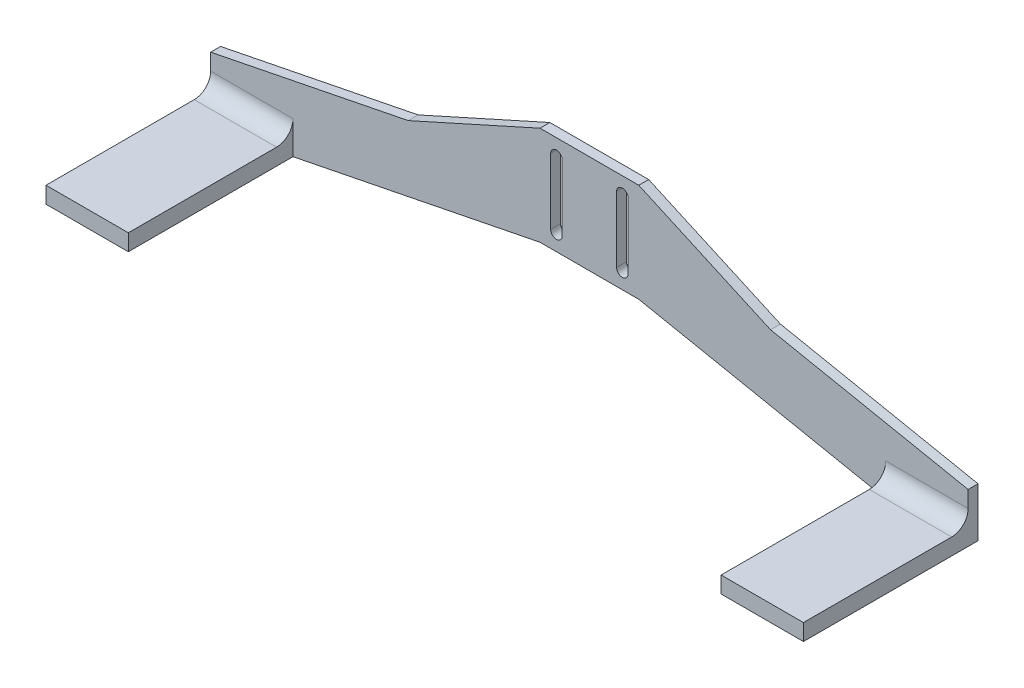
ISO-10303-21;
HEADER;
FILE_DESCRIPTION(('STEP AP214'),'2;1');
FILE_NAME('part.step','',(''),(''),'','','');
FILE_SCHEMA(('AUTOMOTIVE_DESIGN { 1 0 10303 214 1 1 1 1 }'));
ENDSEC;
DATA;
#1=APPLICATION_CONTEXT('core data for automotive mechanical design processes');
#2=APPLICATION_PROTOCOL_DEFINITION('international standard','automotive_design',2000,#1);
#3=PRODUCT_CONTEXT('',#1,'mechanical');
#4=PRODUCT('Part','Part','',(#3));
#5=PRODUCT_RELATED_PRODUCT_CATEGORY('part','',(#4));
#6=PRODUCT_DEFINITION_FORMATION('','',#4);
#7=PRODUCT_DEFINITION_CONTEXT('part definition',#1,'design');
#8=PRODUCT_DEFINITION('design','',#6,#7);
#9=PRODUCT_DEFINITION_SHAPE('','',#8);
#10=(LENGTH_UNIT() NAMED_UNIT(*) SI_UNIT(.MILLI.,.METRE.));
#11=(NAMED_UNIT(*) PLANE_ANGLE_UNIT() SI_UNIT($,.RADIAN.));
#12=(NAMED_UNIT(*) SI_UNIT($,.STERADIAN.) SOLID_ANGLE_UNIT());
#13=UNCERTAINTY_MEASURE_WITH_UNIT(LENGTH_MEASURE(1.E-05),#10,'distance_accuracy_value','');
#14=(GEOMETRIC_REPRESENTATION_CONTEXT(3) GLOBAL_UNCERTAINTY_ASSIGNED_CONTEXT((#13)) GLOBAL_UNIT_ASSIGNED_CONTEXT((#10,
#11,#12)) REPRESENTATION_CONTEXT('',''));
#15=CARTESIAN_POINT('',(0.,0.,0.));
#16=DIRECTION('',(0.,0.,1.));
#17=DIRECTION('',(1.,0.,0.));
#18=AXIS2_PLACEMENT_3D('',#15,#16,#17);
#19=CARTESIAN_POINT('',(0.,0.,3.));
#20=DIRECTION('',(0.,0.,1.));
#21=DIRECTION('',(1.,0.,0.));
#22=AXIS2_PLACEMENT_3D('',#19,#20,#21);
#23=PLANE('',#22);
#24=DIRECTION('',(0.,1.,0.));
#25=VECTOR('',#24,1.);
#26=CARTESIAN_POINT('',(90.,-30.,3.));
#27=LINE('',#26,#25);
#28=CARTESIAN_POINT('',(90.,-30.,3.));
#29=VERTEX_POINT('',#28);
#30=CARTESIAN_POINT('',(90.,-20.,3.));
#31=VERTEX_POINT('',#30);
#32=EDGE_CURVE('E237',#29,#31,#27,.T.);
#33=ORIENTED_EDGE('',*,*,#32,.T.);
#34=DIRECTION('',(1.,0.,0.));
#35=VECTOR('',#34,1.);
#36=CARTESIAN_POINT('',(115.,-20.,3.));
#37=LINE('',#36,#35);
#38=CARTESIAN_POINT('',(115.,-20.,3.));
#39=VERTEX_POINT('',#38);
#40=EDGE_CURVE('E386',#31,#39,#37,.T.);
#41=ORIENTED_EDGE('',*,*,#40,.T.);
#42=DIRECTION('',(0.,1.,0.));
#43=VECTOR('',#42,1.);
#44=CARTESIAN_POINT('',(115.,-1.06396373193244E-13,3.));
#45=LINE('',#44,#43);
#46=CARTESIAN_POINT('',(115.,-15.,3.));
#47=VERTEX_POINT('',#46);
#48=EDGE_CURVE('E264',#39,#47,#45,.T.);
#49=ORIENTED_EDGE('',*,*,#48,.T.);
#50=DIRECTION('',(-0.98058067569092,0.196116135138184,0.));
#51=VECTOR('',#50,1.);
#52=CARTESIAN_POINT('',(1.53846153846154,7.69230769230769,3.));
#53=LINE('',#52,#51);
#54=CARTESIAN_POINT('',(55.,-3.,3.));
#55=VERTEX_POINT('',#54);
#56=EDGE_CURVE('E266',#47,#55,#53,.T.);
#57=ORIENTED_EDGE('',*,*,#56,.T.);
#58=DIRECTION('',(-0.911921505175107,0.410364677328798,0.));
#59=VECTOR('',#58,1.);
#60=CARTESIAN_POINT('',(8.13929313929313,18.0873180873181,3.));
#61=LINE('',#60,#59);
#62=CARTESIAN_POINT('',(15.,15.,3.));
#63=VERTEX_POINT('',#62);
#64=EDGE_CURVE('E344',#55,#63,#61,.T.);
#65=ORIENTED_EDGE('',*,*,#64,.T.);
#66=DIRECTION('',(1.,0.,0.));
#67=VECTOR('',#66,1.);
#68=CARTESIAN_POINT('',(0.,15.,3.));
#69=LINE('',#68,#67);
#70=CARTESIAN_POINT('',(-15.,15.,3.));
#71=VERTEX_POINT('',#70);
#72=EDGE_CURVE('E423',#71,#63,#69,.T.);
#73=ORIENTED_EDGE('',*,*,#72,.F.);
#74=DIRECTION('',(0.911921505175106,0.410364677328798,0.));
#75=VECTOR('',#74,1.);
#76=CARTESIAN_POINT('',(-8.13929313929315,18.0873180873181,3.));
#77=LINE('',#76,#75);
#78=CARTESIAN_POINT('',(-55.,-3.00000000000001,3.));
#79=VERTEX_POINT('',#78);
#80=EDGE_CURVE('E432',#79,#71,#77,.T.);
#81=ORIENTED_EDGE('',*,*,#80,.F.);
#82=DIRECTION('',(0.98058067569092,0.196116135138184,0.));
#83=VECTOR('',#82,1.);
#84=CARTESIAN_POINT('',(-1.53846153846154,7.69230769230768,3.));
#85=LINE('',#84,#83);
#86=CARTESIAN_POINT('',(-115.,-15.,3.));
#87=VERTEX_POINT('',#86);
#88=EDGE_CURVE('E258',#87,#79,#85,.T.);
#89=ORIENTED_EDGE('',*,*,#88,.F.);
#90=DIRECTION('',(0.,1.,0.));
#91=VECTOR('',#90,1.);
#92=CARTESIAN_POINT('',(-115.,-1.06396373193244E-13,3.));
#93=LINE('',#92,#91);
#94=CARTESIAN_POINT('',(-115.,-20.,3.));
#95=VERTEX_POINT('',#94);
#96=EDGE_CURVE('E254',#95,#87,#93,.T.);
#97=ORIENTED_EDGE('',*,*,#96,.F.);
#98=DIRECTION('',(1.,0.,0.));
#99=VECTOR('',#98,1.);
#100=CARTESIAN_POINT('',(-90.,-20.,3.));
#101=LINE('',#100,#99);
#102=CARTESIAN_POINT('',(-90.,-20.,3.));
#103=VERTEX_POINT('',#102);
#104=EDGE_CURVE('E236',#95,#103,#101,.T.);
#105=ORIENTED_EDGE('',*,*,#104,.T.);
#106=DIRECTION('',(0.,-1.,0.));
#107=VECTOR('',#106,1.);
#108=CARTESIAN_POINT('',(-90.,-30.,3.));
#109=LINE('',#108,#107);
#110=CARTESIAN_POINT('',(-90.,-30.,3.));
#111=VERTEX_POINT('',#110);
#112=EDGE_CURVE('E219',#103,#111,#109,.T.);
#113=ORIENTED_EDGE('',*,*,#112,.T.);
#114=DIRECTION('',(-0.98058067569092,-0.196116135138184,0.));
#115=VECTOR('',#114,1.);
#116=CARTESIAN_POINT('',(2.30769230769231,-11.5384615384616,3.));
#117=LINE('',#116,#115);
#118=CARTESIAN_POINT('',(-15.,-15.,3.));
#119=VERTEX_POINT('',#118);
#120=EDGE_CURVE('E233',#119,#111,#117,.T.);
#121=ORIENTED_EDGE('',*,*,#120,.F.);
#122=DIRECTION('',(1.,0.,0.));
#123=VECTOR('',#122,1.);
#124=CARTESIAN_POINT('',(0.,-15.,3.));
#125=LINE('',#124,#123);
#126=CARTESIAN_POINT('',(15.,-15.,3.));
#127=VERTEX_POINT('',#126);
#128=EDGE_CURVE('E253',#119,#127,#125,.T.);
#129=ORIENTED_EDGE('',*,*,#128,.T.);
#130=DIRECTION('',(0.98058067569092,-0.196116135138184,0.));
#131=VECTOR('',#130,1.);
#132=CARTESIAN_POINT('',(-2.30769230769231,-11.5384615384615,3.));
#133=LINE('',#132,#131);
#134=EDGE_CURVE('E256',#127,#29,#133,.T.);
#135=ORIENTED_EDGE('',*,*,#134,.T.);
#136=EDGE_LOOP('',(#33,#41,#49,#57,#65,#73,#81,#89,#97,#105,#113,#121,#129,#135));
#137=FACE_BOUND('',#136,.T.);
#138=CARTESIAN_POINT('',(-10.,9.99999999999999,3.));
#139=DIRECTION('',(0.,0.,1.));
#140=DIRECTION('',(1.,0.,0.));
#141=AXIS2_PLACEMENT_3D('',#138,#139,#140);
#142=CIRCLE('',#141,1.74999999999997);
#143=CARTESIAN_POINT('',(-8.24999999999999,9.99999999999999,3.));
#144=VERTEX_POINT('',#143);
#145=CARTESIAN_POINT('',(-11.75,9.99999999999999,3.));
#146=VERTEX_POINT('',#145);
#147=EDGE_CURVE('E268',#144,#146,#142,.T.);
#148=ORIENTED_EDGE('',*,*,#147,.F.);
#149=DIRECTION('',(0.,-1.,0.));
#150=VECTOR('',#149,1.);
#151=CARTESIAN_POINT('',(-8.24999999999999,0.,3.));
#152=LINE('',#151,#150);
#153=CARTESIAN_POINT('',(-8.24999999999998,-10.,3.));
#154=VERTEX_POINT('',#153);
#155=EDGE_CURVE('E271',#144,#154,#152,.T.);
#156=ORIENTED_EDGE('',*,*,#155,.T.);
#157=CARTESIAN_POINT('',(-9.99999999999998,-10.,3.));
#158=DIRECTION('',(0.,0.,1.));
#159=DIRECTION('',(1.,0.,0.));
#160=AXIS2_PLACEMENT_3D('',#157,#158,#159);
#161=CIRCLE('',#160,1.74999999999997);
#162=CARTESIAN_POINT('',(-11.75,-10.,3.));
#163=VERTEX_POINT('',#162);
#164=EDGE_CURVE('E273',#163,#154,#161,.T.);
#165=ORIENTED_EDGE('',*,*,#164,.F.);
#166=DIRECTION('',(0.,-1.,0.));
#167=VECTOR('',#166,1.);
#168=CARTESIAN_POINT('',(-11.75,0.,3.));
#169=LINE('',#168,#167);
#170=EDGE_CURVE('E276',#146,#163,#169,.T.);
#171=ORIENTED_EDGE('',*,*,#170,.F.);
#172=EDGE_LOOP('',(#148,#156,#165,#171));
#173=FACE_BOUND('',#172,.T.);
#174=CARTESIAN_POINT('',(10.,-9.99999999999998,3.));
#175=DIRECTION('',(0.,0.,1.));
#176=DIRECTION('',(1.,0.,0.));
#177=AXIS2_PLACEMENT_3D('',#174,#175,#176);
#178=CIRCLE('',#177,1.75);
#179=CARTESIAN_POINT('',(8.25,-9.99999999999998,3.));
#180=VERTEX_POINT('',#179);
#181=CARTESIAN_POINT('',(11.75,-9.99999999999998,3.));
#182=VERTEX_POINT('',#181);
#183=EDGE_CURVE('E279',#180,#182,#178,.T.);
#184=ORIENTED_EDGE('',*,*,#183,.F.);
#185=DIRECTION('',(0.,-1.,0.));
#186=VECTOR('',#185,1.);
#187=CARTESIAN_POINT('',(8.25,0.,3.));
#188=LINE('',#187,#186);
#189=CARTESIAN_POINT('',(8.24999999999999,10.,3.));
#190=VERTEX_POINT('',#189);
#191=EDGE_CURVE('E282',#190,#180,#188,.T.);
#192=ORIENTED_EDGE('',*,*,#191,.F.);
#193=CARTESIAN_POINT('',(10.,10.,3.));
#194=DIRECTION('',(0.,0.,1.));
#195=DIRECTION('',(1.,0.,0.));
#196=AXIS2_PLACEMENT_3D('',#193,#194,#195);
#197=CIRCLE('',#196,1.75);
#198=CARTESIAN_POINT('',(11.75,10.,3.));
#199=VERTEX_POINT('',#198);
#200=EDGE_CURVE('E285',#199,#190,#197,.T.);
#201=ORIENTED_EDGE('',*,*,#200,.F.);
#202=DIRECTION('',(0.,-1.,0.));
#203=VECTOR('',#202,1.);
#204=CARTESIAN_POINT('',(11.75,0.,3.));
#205=LINE('',#204,#203);
#206=EDGE_CURVE('E288',#199,#182,#205,.T.);
#207=ORIENTED_EDGE('',*,*,#206,.T.);
#208=EDGE_LOOP('',(#184,#192,#201,#207));
#209=FACE_BOUND('',#208,.T.);
#210=ADVANCED_FACE('F41',(#137,#173,#209),#23,.T.);
#211=CARTESIAN_POINT('',(10.,-9.99999999999998,3.));
#212=DIRECTION('',(0.,0.,-1.));
#213=DIRECTION('',(-1.,0.,0.));
#214=AXIS2_PLACEMENT_3D('',#211,#212,#213);
#215=CYLINDRICAL_SURFACE('',#214,1.75);
#216=CARTESIAN_POINT('',(10.,-9.99999999999998,0.));
#217=DIRECTION('',(0.,0.,1.));
#218=DIRECTION('',(1.,0.,0.));
#219=AXIS2_PLACEMENT_3D('',#216,#217,#218);
#220=CIRCLE('',#219,1.75);
#221=CARTESIAN_POINT('',(8.25,-9.99999999999998,0.));
#222=VERTEX_POINT('',#221);
#223=CARTESIAN_POINT('',(11.75,-9.99999999999998,0.));
#224=VERTEX_POINT('',#223);
#225=EDGE_CURVE('E332',#222,#224,#220,.T.);
#226=ORIENTED_EDGE('',*,*,#225,.F.);
#227=DIRECTION('',(0.,0.,-1.));
#228=VECTOR('',#227,1.);
#229=CARTESIAN_POINT('',(8.25,-9.99999999999998,3.));
#230=LINE('',#229,#228);
#231=EDGE_CURVE('E352',#180,#222,#230,.T.);
#232=ORIENTED_EDGE('',*,*,#231,.F.);
#233=ORIENTED_EDGE('',*,*,#183,.T.);
#234=DIRECTION('',(0.,0.,-1.));
#235=VECTOR('',#234,1.);
#236=CARTESIAN_POINT('',(11.75,-9.99999999999998,3.));
#237=LINE('',#236,#235);
#238=EDGE_CURVE('E345',#182,#224,#237,.T.);
#239=ORIENTED_EDGE('',*,*,#238,.T.);
#240=EDGE_LOOP('',(#226,#232,#233,#239));
#241=FACE_BOUND('',#240,.T.);
#242=ADVANCED_FACE('F462',(#241),#215,.F.);
#243=CARTESIAN_POINT('',(8.25,0.,3.));
#244=DIRECTION('',(1.,0.,0.));
#245=DIRECTION('',(0.,1.,0.));
#246=AXIS2_PLACEMENT_3D('',#243,#244,#245);
#247=PLANE('',#246);
#248=DIRECTION('',(0.,-1.,0.));
#249=VECTOR('',#248,1.);
#250=CARTESIAN_POINT('',(8.25,0.,0.));
#251=LINE('',#250,#249);
#252=CARTESIAN_POINT('',(8.24999999999999,10.,0.));
#253=VERTEX_POINT('',#252);
#254=EDGE_CURVE('E335',#253,#222,#251,.T.);
#255=ORIENTED_EDGE('',*,*,#254,.F.);
#256=DIRECTION('',(0.,0.,-1.));
#257=VECTOR('',#256,1.);
#258=CARTESIAN_POINT('',(8.24999999999999,10.,3.));
#259=LINE('',#258,#257);
#260=EDGE_CURVE('E350',#190,#253,#259,.T.);
#261=ORIENTED_EDGE('',*,*,#260,.F.);
#262=ORIENTED_EDGE('',*,*,#191,.T.);
#263=ORIENTED_EDGE('',*,*,#231,.T.);
#264=EDGE_LOOP('',(#255,#261,#262,#263));
#265=FACE_BOUND('',#264,.T.);
#266=ADVANCED_FACE('F467',(#265),#247,.T.);
#267=CARTESIAN_POINT('',(10.,10.,3.));
#268=DIRECTION('',(0.,0.,-1.));
#269=DIRECTION('',(-1.,0.,0.));
#270=AXIS2_PLACEMENT_3D('',#267,#268,#269);
#271=CYLINDRICAL_SURFACE('',#270,1.75);
#272=CARTESIAN_POINT('',(10.,10.,0.));
#273=DIRECTION('',(0.,0.,1.));
#274=DIRECTION('',(1.,0.,0.));
#275=AXIS2_PLACEMENT_3D('',#272,#273,#274);
#276=CIRCLE('',#275,1.75);
#277=CARTESIAN_POINT('',(11.75,10.,0.));
#278=VERTEX_POINT('',#277);
#279=EDGE_CURVE('E338',#278,#253,#276,.T.);
#280=ORIENTED_EDGE('',*,*,#279,.F.);
#281=DIRECTION('',(0.,0.,-1.));
#282=VECTOR('',#281,1.);
#283=CARTESIAN_POINT('',(11.75,10.,3.));
#284=LINE('',#283,#282);
#285=EDGE_CURVE('E347',#199,#278,#284,.T.);
#286=ORIENTED_EDGE('',*,*,#285,.F.);
#287=ORIENTED_EDGE('',*,*,#200,.T.);
#288=ORIENTED_EDGE('',*,*,#260,.T.);
#289=EDGE_LOOP('',(#280,#286,#287,#288));
#290=FACE_BOUND('',#289,.T.);
#291=ADVANCED_FACE('F480',(#290),#271,.F.);
#292=CARTESIAN_POINT('',(-10.,9.99999999999999,3.));
#293=DIRECTION('',(0.,0.,-1.));
#294=DIRECTION('',(-1.,0.,0.));
#295=AXIS2_PLACEMENT_3D('',#292,#293,#294);
#296=CYLINDRICAL_SURFACE('',#295,1.74999999999997);
#297=CARTESIAN_POINT('',(-10.,9.99999999999999,0.));
#298=DIRECTION('',(0.,0.,1.));
#299=DIRECTION('',(1.,0.,0.));
#300=AXIS2_PLACEMENT_3D('',#297,#298,#299);
#301=CIRCLE('',#300,1.74999999999997);
#302=CARTESIAN_POINT('',(-8.24999999999999,9.99999999999999,0.));
#303=VERTEX_POINT('',#302);
#304=CARTESIAN_POINT('',(-11.75,9.99999999999999,0.));
#305=VERTEX_POINT('',#304);
#306=EDGE_CURVE('E320',#303,#305,#301,.T.);
#307=ORIENTED_EDGE('',*,*,#306,.F.);
#308=DIRECTION('',(0.,0.,-1.));
#309=VECTOR('',#308,1.);
#310=CARTESIAN_POINT('',(-8.24999999999999,9.99999999999999,3.));
#311=LINE('',#310,#309);
#312=EDGE_CURVE('E348',#144,#303,#311,.T.);
#313=ORIENTED_EDGE('',*,*,#312,.F.);
#314=ORIENTED_EDGE('',*,*,#147,.T.);
#315=DIRECTION('',(0.,0.,-1.));
#316=VECTOR('',#315,1.);
#317=CARTESIAN_POINT('',(-11.75,9.99999999999999,3.));
#318=LINE('',#317,#316);
#319=EDGE_CURVE('E354',#146,#305,#318,.T.);
#320=ORIENTED_EDGE('',*,*,#319,.T.);
#321=EDGE_LOOP('',(#307,#313,#314,#320));
#322=FACE_BOUND('',#321,.T.);
#323=ADVANCED_FACE('F483',(#322),#296,.F.);
#324=CARTESIAN_POINT('',(-8.24999999999999,0.,3.));
#325=DIRECTION('',(1.,0.,0.));
#326=DIRECTION('',(0.,1.,0.));
#327=AXIS2_PLACEMENT_3D('',#324,#325,#326);
#328=PLANE('',#327);
#329=DIRECTION('',(0.,-1.,0.));
#330=VECTOR('',#329,1.);
#331=CARTESIAN_POINT('',(-8.24999999999999,0.,0.));
#332=LINE('',#331,#330);
#333=CARTESIAN_POINT('',(-8.24999999999998,-10.,0.));
#334=VERTEX_POINT('',#333);
#335=EDGE_CURVE('E323',#303,#334,#332,.T.);
#336=ORIENTED_EDGE('',*,*,#335,.T.);
#337=DIRECTION('',(0.,0.,-1.));
#338=VECTOR('',#337,1.);
#339=CARTESIAN_POINT('',(-8.24999999999998,-10.,3.));
#340=LINE('',#339,#338);
#341=EDGE_CURVE('E359',#154,#334,#340,.T.);
#342=ORIENTED_EDGE('',*,*,#341,.F.);
#343=ORIENTED_EDGE('',*,*,#155,.F.);
#344=ORIENTED_EDGE('',*,*,#312,.T.);
#345=EDGE_LOOP('',(#336,#342,#343,#344));
#346=FACE_BOUND('',#345,.T.);
#347=ADVANCED_FACE('F495',(#346),#328,.F.);
#348=CARTESIAN_POINT('',(-9.99999999999998,-10.,3.));
#349=DIRECTION('',(0.,0.,-1.));
#350=DIRECTION('',(-1.,0.,0.));
#351=AXIS2_PLACEMENT_3D('',#348,#349,#350);
#352=CYLINDRICAL_SURFACE('',#351,1.74999999999997);
#353=CARTESIAN_POINT('',(-9.99999999999998,-10.,0.));
#354=DIRECTION('',(0.,0.,1.));
#355=DIRECTION('',(1.,0.,0.));
#356=AXIS2_PLACEMENT_3D('',#353,#354,#355);
#357=CIRCLE('',#356,1.74999999999997);
#358=CARTESIAN_POINT('',(-11.75,-10.,0.));
#359=VERTEX_POINT('',#358);
#360=EDGE_CURVE('E326',#359,#334,#357,.T.);
#361=ORIENTED_EDGE('',*,*,#360,.F.);
#362=DIRECTION('',(0.,0.,-1.));
#363=VECTOR('',#362,1.);
#364=CARTESIAN_POINT('',(-11.75,-10.,3.));
#365=LINE('',#364,#363);
#366=EDGE_CURVE('E356',#163,#359,#365,.T.);
#367=ORIENTED_EDGE('',*,*,#366,.F.);
#368=ORIENTED_EDGE('',*,*,#164,.T.);
#369=ORIENTED_EDGE('',*,*,#341,.T.);
#370=EDGE_LOOP('',(#361,#367,#368,#369));
#371=FACE_BOUND('',#370,.T.);
#372=ADVANCED_FACE('F492',(#371),#352,.F.);
#373=CARTESIAN_POINT('',(8.13929313929313,18.0873180873181,3.));
#374=DIRECTION('',(-0.410364677328798,-0.911921505175106,0.));
#375=DIRECTION('',(0.911921505175107,-0.410364677328798,0.));
#376=AXIS2_PLACEMENT_3D('',#373,#374,#375);
#377=PLANE('',#376);
#378=DIRECTION('',(-0.911921505175107,0.410364677328798,0.));
#379=VECTOR('',#378,1.);
#380=CARTESIAN_POINT('',(8.13929313929313,18.0873180873181,0.));
#381=LINE('',#380,#379);
#382=CARTESIAN_POINT('',(55.,-3.,0.));
#383=VERTEX_POINT('',#382);
#384=CARTESIAN_POINT('',(15.,15.,0.));
#385=VERTEX_POINT('',#384);
#386=EDGE_CURVE('E291',#383,#385,#381,.T.);
#387=ORIENTED_EDGE('',*,*,#386,.T.);
#388=DIRECTION('',(0.,0.,-1.));
#389=VECTOR('',#388,1.);
#390=CARTESIAN_POINT('',(15.,15.,3.));
#391=LINE('',#390,#389);
#392=EDGE_CURVE('E357',#63,#385,#391,.T.);
#393=ORIENTED_EDGE('',*,*,#392,.F.);
#394=ORIENTED_EDGE('',*,*,#64,.F.);
#395=DIRECTION('',(0.,0.,-1.));
#396=VECTOR('',#395,1.);
#397=CARTESIAN_POINT('',(55.,-3.,3.));
#398=LINE('',#397,#396);
#399=EDGE_CURVE('E290',#55,#383,#398,.T.);
#400=ORIENTED_EDGE('',*,*,#399,.T.);
#401=EDGE_LOOP('',(#387,#393,#394,#400));
#402=FACE_BOUND('',#401,.T.);
#403=ADVANCED_FACE('F427',(#402),#377,.F.);
#404=CARTESIAN_POINT('',(0.,15.,3.));
#405=DIRECTION('',(0.,1.,0.));
#406=DIRECTION('',(-1.,0.,0.));
#407=AXIS2_PLACEMENT_3D('',#404,#405,#406);
#408=PLANE('',#407);
#409=DIRECTION('',(1.,0.,0.));
#410=VECTOR('',#409,1.);
#411=CARTESIAN_POINT('',(0.,15.,0.));
#412=LINE('',#411,#410);
#413=CARTESIAN_POINT('',(-15.,15.,0.));
#414=VERTEX_POINT('',#413);
#415=EDGE_CURVE('E294',#414,#385,#412,.T.);
#416=ORIENTED_EDGE('',*,*,#415,.F.);
#417=DIRECTION('',(0.,0.,-1.));
#418=VECTOR('',#417,1.);
#419=CARTESIAN_POINT('',(-15.,15.,3.));
#420=LINE('',#419,#418);
#421=EDGE_CURVE('E382',#71,#414,#420,.T.);
#422=ORIENTED_EDGE('',*,*,#421,.F.);
#423=ORIENTED_EDGE('',*,*,#72,.T.);
#424=ORIENTED_EDGE('',*,*,#392,.T.);
#425=EDGE_LOOP('',(#416,#422,#423,#424));
#426=FACE_BOUND('',#425,.T.);
#427=ADVANCED_FACE('F431',(#426),#408,.T.);
#428=CARTESIAN_POINT('',(-8.13929313929315,18.0873180873181,3.));
#429=DIRECTION('',(-0.410364677328798,0.911921505175106,0.));
#430=DIRECTION('',(-0.911921505175106,-0.410364677328798,0.));
#431=AXIS2_PLACEMENT_3D('',#428,#429,#430);
#432=PLANE('',#431);
#433=DIRECTION('',(0.911921505175106,0.410364677328798,0.));
#434=VECTOR('',#433,1.);
#435=CARTESIAN_POINT('',(-8.13929313929315,18.0873180873181,0.));
#436=LINE('',#435,#434);
#437=CARTESIAN_POINT('',(-55.,-3.00000000000001,0.));
#438=VERTEX_POINT('',#437);
#439=EDGE_CURVE('E298',#438,#414,#436,.T.);
#440=ORIENTED_EDGE('',*,*,#439,.F.);
#441=DIRECTION('',(0.,0.,-1.));
#442=VECTOR('',#441,1.);
#443=CARTESIAN_POINT('',(-55.,-3.00000000000001,3.));
#444=LINE('',#443,#442);
#445=EDGE_CURVE('E380',#79,#438,#444,.T.);
#446=ORIENTED_EDGE('',*,*,#445,.F.);
#447=ORIENTED_EDGE('',*,*,#80,.T.);
#448=ORIENTED_EDGE('',*,*,#421,.T.);
#449=EDGE_LOOP('',(#440,#446,#447,#448));
#450=FACE_BOUND('',#449,.T.);
#451=ADVANCED_FACE('F444',(#450),#432,.T.);
#452=CARTESIAN_POINT('',(-1.53846153846154,7.69230769230768,3.));
#453=DIRECTION('',(-0.196116135138184,0.98058067569092,0.));
#454=DIRECTION('',(-0.98058067569092,-0.196116135138184,0.));
#455=AXIS2_PLACEMENT_3D('',#452,#453,#454);
#456=PLANE('',#455);
#457=DIRECTION('',(0.98058067569092,0.196116135138184,0.));
#458=VECTOR('',#457,1.);
#459=CARTESIAN_POINT('',(-1.53846153846154,7.69230769230768,0.));
#460=LINE('',#459,#458);
#461=CARTESIAN_POINT('',(-115.,-15.,0.));
#462=VERTEX_POINT('',#461);
#463=EDGE_CURVE('E301',#462,#438,#460,.T.);
#464=ORIENTED_EDGE('',*,*,#463,.F.);
#465=DIRECTION('',(0.,0.,-1.));
#466=VECTOR('',#465,1.);
#467=CARTESIAN_POINT('',(-115.,-15.,3.));
#468=LINE('',#467,#466);
#469=EDGE_CURVE('E378',#87,#462,#468,.T.);
#470=ORIENTED_EDGE('',*,*,#469,.F.);
#471=ORIENTED_EDGE('',*,*,#88,.T.);
#472=ORIENTED_EDGE('',*,*,#445,.T.);
#473=EDGE_LOOP('',(#464,#470,#471,#472));
#474=FACE_BOUND('',#473,.T.);
#475=ADVANCED_FACE('F441',(#474),#456,.T.);
#476=CARTESIAN_POINT('',(-115.,-1.06396373193244E-13,3.));
#477=DIRECTION('',(-1.,0.,0.));
#478=DIRECTION('',(0.,-1.,0.));
#479=AXIS2_PLACEMENT_3D('',#476,#477,#478);
#480=PLANE('',#479);
#481=DIRECTION('',(0.,1.,0.));
#482=VECTOR('',#481,1.);
#483=CARTESIAN_POINT('',(-115.,-1.06396373193244E-13,0.));
#484=LINE('',#483,#482);
#485=CARTESIAN_POINT('',(-115.,-30.,0.));
#486=VERTEX_POINT('',#485);
#487=EDGE_CURVE('E304',#486,#462,#484,.T.);
#488=ORIENTED_EDGE('',*,*,#487,.F.);
#489=DIRECTION('',(0.,0.,-1.));
#490=VECTOR('',#489,1.);
#491=CARTESIAN_POINT('',(-115.,-30.,3.));
#492=LINE('',#491,#490);
#493=CARTESIAN_POINT('',(-115.,-30.,53.));
#494=VERTEX_POINT('',#493);
#495=EDGE_CURVE('E248',#494,#486,#492,.T.);
#496=ORIENTED_EDGE('',*,*,#495,.F.);
#497=DIRECTION('',(0.,1.,0.));
#498=VECTOR('',#497,1.);
#499=CARTESIAN_POINT('',(-115.,-30.,53.));
#500=LINE('',#499,#498);
#501=CARTESIAN_POINT('',(-115.,-25.,53.));
#502=VERTEX_POINT('',#501);
#503=EDGE_CURVE('E868',#494,#502,#500,.T.);
#504=ORIENTED_EDGE('',*,*,#503,.T.);
#505=DIRECTION('',(0.,0.,-1.));
#506=VECTOR('',#505,1.);
#507=CARTESIAN_POINT('',(-115.,-25.,53.));
#508=LINE('',#507,#506);
#509=CARTESIAN_POINT('',(-115.,-25.,8.));
#510=VERTEX_POINT('',#509);
#511=EDGE_CURVE('E454',#502,#510,#508,.T.);
#512=ORIENTED_EDGE('',*,*,#511,.T.);
#513=CARTESIAN_POINT('',(-115.,-20.,8.));
#514=DIRECTION('',(-1.,0.,0.));
#515=DIRECTION('',(0.,-1.,0.));
#516=AXIS2_PLACEMENT_3D('',#513,#514,#515);
#517=CIRCLE('',#516,5.);
#518=EDGE_CURVE('E11',#510,#95,#517,.F.);
#519=ORIENTED_EDGE('',*,*,#518,.T.);
#520=ORIENTED_EDGE('',*,*,#96,.T.);
#521=ORIENTED_EDGE('',*,*,#469,.T.);
#522=EDGE_LOOP('',(#488,#496,#504,#512,#519,#520,#521));
#523=FACE_BOUND('',#522,.T.);
#524=ADVANCED_FACE('F450',(#523),#480,.T.);
#525=CARTESIAN_POINT('',(0.,-30.,3.));
#526=DIRECTION('',(0.,-1.,0.));
#527=DIRECTION('',(1.,0.,0.));
#528=AXIS2_PLACEMENT_3D('',#525,#526,#527);
#529=PLANE('',#528);
#530=DIRECTION('',(-1.,0.,0.));
#531=VECTOR('',#530,1.);
#532=CARTESIAN_POINT('',(0.,-30.,0.));
#533=LINE('',#532,#531);
#534=CARTESIAN_POINT('',(-90.,-30.,0.));
#535=VERTEX_POINT('',#534);
#536=EDGE_CURVE('E244',#535,#486,#533,.T.);
#537=ORIENTED_EDGE('',*,*,#536,.F.);
#538=DIRECTION('',(0.,0.,-1.));
#539=VECTOR('',#538,1.);
#540=CARTESIAN_POINT('',(-90.,-30.,3.));
#541=LINE('',#540,#539);
#542=EDGE_CURVE('E241',#111,#535,#541,.T.);
#543=ORIENTED_EDGE('',*,*,#542,.F.);
#544=DIRECTION('',(0.,0.,-1.));
#545=VECTOR('',#544,1.);
#546=CARTESIAN_POINT('',(-90.,-30.,53.));
#547=LINE('',#546,#545);
#548=CARTESIAN_POINT('',(-90.,-30.,53.));
#549=VERTEX_POINT('',#548);
#550=EDGE_CURVE('E216',#549,#111,#547,.T.);
#551=ORIENTED_EDGE('',*,*,#550,.F.);
#552=DIRECTION('',(-1.,0.,0.));
#553=VECTOR('',#552,1.);
#554=CARTESIAN_POINT('',(-115.,-30.,53.));
#555=LINE('',#554,#553);
#556=EDGE_CURVE('E238',#549,#494,#555,.T.);
#557=ORIENTED_EDGE('',*,*,#556,.T.);
#558=ORIENTED_EDGE('',*,*,#495,.T.);
#559=EDGE_LOOP('',(#537,#543,#551,#557,#558));
#560=FACE_BOUND('',#559,.T.);
#561=ADVANCED_FACE('F242',(#560),#529,.T.);
#562=CARTESIAN_POINT('',(2.30769230769231,-11.5384615384616,3.));
#563=DIRECTION('',(0.196116135138184,-0.98058067569092,0.));
#564=DIRECTION('',(0.98058067569092,0.196116135138184,0.));
#565=AXIS2_PLACEMENT_3D('',#562,#563,#564);
#566=PLANE('',#565);
#567=DIRECTION('',(-0.98058067569092,-0.196116135138184,0.));
#568=VECTOR('',#567,1.);
#569=CARTESIAN_POINT('',(2.30769230769231,-11.5384615384616,0.));
#570=LINE('',#569,#568);
#571=CARTESIAN_POINT('',(-15.,-15.,0.));
#572=VERTEX_POINT('',#571);
#573=EDGE_CURVE('E308',#572,#535,#570,.T.);
#574=ORIENTED_EDGE('',*,*,#573,.F.);
#575=DIRECTION('',(0.,0.,-1.));
#576=VECTOR('',#575,1.);
#577=CARTESIAN_POINT('',(-15.,-15.,3.));
#578=LINE('',#577,#576);
#579=EDGE_CURVE('E249',#119,#572,#578,.T.);
#580=ORIENTED_EDGE('',*,*,#579,.F.);
#581=ORIENTED_EDGE('',*,*,#120,.T.);
#582=ORIENTED_EDGE('',*,*,#542,.T.);
#583=EDGE_LOOP('',(#574,#580,#581,#582));
#584=FACE_BOUND('',#583,.T.);
#585=ADVANCED_FACE('F251',(#584),#566,.T.);
#586=CARTESIAN_POINT('',(0.,-15.,3.));
#587=DIRECTION('',(0.,1.,0.));
#588=DIRECTION('',(-1.,0.,0.));
#589=AXIS2_PLACEMENT_3D('',#586,#587,#588);
#590=PLANE('',#589);
#591=DIRECTION('',(1.,0.,0.));
#592=VECTOR('',#591,1.);
#593=CARTESIAN_POINT('',(0.,-15.,0.));
#594=LINE('',#593,#592);
#595=CARTESIAN_POINT('',(15.,-15.,0.));
#596=VERTEX_POINT('',#595);
#597=EDGE_CURVE('E310',#572,#596,#594,.T.);
#598=ORIENTED_EDGE('',*,*,#597,.T.);
#599=DIRECTION('',(0.,0.,-1.));
#600=VECTOR('',#599,1.);
#601=CARTESIAN_POINT('',(15.,-15.,3.));
#602=LINE('',#601,#600);
#603=EDGE_CURVE('E373',#127,#596,#602,.T.);
#604=ORIENTED_EDGE('',*,*,#603,.F.);
#605=ORIENTED_EDGE('',*,*,#128,.F.);
#606=ORIENTED_EDGE('',*,*,#579,.T.);
#607=EDGE_LOOP('',(#598,#604,#605,#606));
#608=FACE_BOUND('',#607,.T.);
#609=ADVANCED_FACE('F514',(#608),#590,.F.);
#610=CARTESIAN_POINT('',(-2.30769230769231,-11.5384615384615,3.));
#611=DIRECTION('',(0.196116135138184,0.98058067569092,0.));
#612=DIRECTION('',(-0.98058067569092,0.196116135138184,0.));
#613=AXIS2_PLACEMENT_3D('',#610,#611,#612);
#614=PLANE('',#613);
#615=DIRECTION('',(0.98058067569092,-0.196116135138184,0.));
#616=VECTOR('',#615,1.);
#617=CARTESIAN_POINT('',(-2.30769230769231,-11.5384615384615,0.));
#618=LINE('',#617,#616);
#619=CARTESIAN_POINT('',(90.,-30.,0.));
#620=VERTEX_POINT('',#619);
#621=EDGE_CURVE('E312',#596,#620,#618,.T.);
#622=ORIENTED_EDGE('',*,*,#621,.T.);
#623=DIRECTION('',(0.,0.,-1.));
#624=VECTOR('',#623,1.);
#625=CARTESIAN_POINT('',(90.,-30.,3.));
#626=LINE('',#625,#624);
#627=EDGE_CURVE('E370',#29,#620,#626,.T.);
#628=ORIENTED_EDGE('',*,*,#627,.F.);
#629=ORIENTED_EDGE('',*,*,#134,.F.);
#630=ORIENTED_EDGE('',*,*,#603,.T.);
#631=EDGE_LOOP('',(#622,#628,#629,#630));
#632=FACE_BOUND('',#631,.T.);
#633=ADVANCED_FACE('F510',(#632),#614,.F.);
#634=CARTESIAN_POINT('',(0.,-30.,3.));
#635=DIRECTION('',(0.,1.,0.));
#636=DIRECTION('',(-1.,0.,0.));
#637=AXIS2_PLACEMENT_3D('',#634,#635,#636);
#638=PLANE('',#637);
#639=DIRECTION('',(1.,0.,0.));
#640=VECTOR('',#639,1.);
#641=CARTESIAN_POINT('',(0.,-30.,0.));
#642=LINE('',#641,#640);
#643=CARTESIAN_POINT('',(115.,-30.,0.));
#644=VERTEX_POINT('',#643);
#645=EDGE_CURVE('E314',#620,#644,#642,.T.);
#646=ORIENTED_EDGE('',*,*,#645,.T.);
#647=DIRECTION('',(0.,0.,-1.));
#648=VECTOR('',#647,1.);
#649=CARTESIAN_POINT('',(115.,-30.,3.));
#650=LINE('',#649,#648);
#651=CARTESIAN_POINT('',(115.,-30.,53.));
#652=VERTEX_POINT('',#651);
#653=EDGE_CURVE('E367',#652,#644,#650,.T.);
#654=ORIENTED_EDGE('',*,*,#653,.F.);
#655=DIRECTION('',(-1.,0.,0.));
#656=VECTOR('',#655,1.);
#657=CARTESIAN_POINT('',(115.,-30.,53.));
#658=LINE('',#657,#656);
#659=CARTESIAN_POINT('',(90.,-30.,53.));
#660=VERTEX_POINT('',#659);
#661=EDGE_CURVE('E877',#652,#660,#658,.T.);
#662=ORIENTED_EDGE('',*,*,#661,.T.);
#663=DIRECTION('',(0.,0.,-1.));
#664=VECTOR('',#663,1.);
#665=CARTESIAN_POINT('',(90.,-30.,53.));
#666=LINE('',#665,#664);
#667=EDGE_CURVE('E885',#660,#29,#666,.T.);
#668=ORIENTED_EDGE('',*,*,#667,.T.);
#669=ORIENTED_EDGE('',*,*,#627,.T.);
#670=EDGE_LOOP('',(#646,#654,#662,#668,#669));
#671=FACE_BOUND('',#670,.T.);
#672=ADVANCED_FACE('F507',(#671),#638,.F.);
#673=CARTESIAN_POINT('',(115.,-1.06396373193244E-13,3.));
#674=DIRECTION('',(-1.,0.,0.));
#675=DIRECTION('',(0.,-1.,0.));
#676=AXIS2_PLACEMENT_3D('',#673,#674,#675);
#677=PLANE('',#676);
#678=DIRECTION('',(0.,1.,0.));
#679=VECTOR('',#678,1.);
#680=CARTESIAN_POINT('',(115.,-1.06396373193244E-13,0.));
#681=LINE('',#680,#679);
#682=CARTESIAN_POINT('',(115.,-15.,0.));
#683=VERTEX_POINT('',#682);
#684=EDGE_CURVE('E316',#644,#683,#681,.T.);
#685=ORIENTED_EDGE('',*,*,#684,.T.);
#686=DIRECTION('',(0.,0.,-1.));
#687=VECTOR('',#686,1.);
#688=CARTESIAN_POINT('',(115.,-15.,3.));
#689=LINE('',#688,#687);
#690=EDGE_CURVE('E364',#47,#683,#689,.T.);
#691=ORIENTED_EDGE('',*,*,#690,.F.);
#692=ORIENTED_EDGE('',*,*,#48,.F.);
#693=CARTESIAN_POINT('',(115.,-20.,8.));
#694=DIRECTION('',(-1.,0.,0.));
#695=DIRECTION('',(0.,-1.,0.));
#696=AXIS2_PLACEMENT_3D('',#693,#694,#695);
#697=CIRCLE('',#696,5.);
#698=CARTESIAN_POINT('',(115.,-25.,8.));
#699=VERTEX_POINT('',#698);
#700=EDGE_CURVE('E392',#39,#699,#697,.T.);
#701=ORIENTED_EDGE('',*,*,#700,.T.);
#702=DIRECTION('',(0.,0.,-1.));
#703=VECTOR('',#702,1.);
#704=CARTESIAN_POINT('',(115.,-25.,53.));
#705=LINE('',#704,#703);
#706=CARTESIAN_POINT('',(115.,-25.,53.));
#707=VERTEX_POINT('',#706);
#708=EDGE_CURVE('E295',#707,#699,#705,.T.);
#709=ORIENTED_EDGE('',*,*,#708,.F.);
#710=DIRECTION('',(0.,-1.,0.));
#711=VECTOR('',#710,1.);
#712=CARTESIAN_POINT('',(115.,-25.,53.));
#713=LINE('',#712,#711);
#714=EDGE_CURVE('E874',#707,#652,#713,.T.);
#715=ORIENTED_EDGE('',*,*,#714,.T.);
#716=ORIENTED_EDGE('',*,*,#653,.T.);
#717=EDGE_LOOP('',(#685,#691,#692,#701,#709,#715,#716));
#718=FACE_BOUND('',#717,.T.);
#719=ADVANCED_FACE('F410',(#718),#677,.F.);
#720=CARTESIAN_POINT('',(-11.75,0.,3.));
#721=DIRECTION('',(1.,0.,0.));
#722=DIRECTION('',(0.,1.,0.));
#723=AXIS2_PLACEMENT_3D('',#720,#721,#722);
#724=PLANE('',#723);
#725=DIRECTION('',(0.,-1.,0.));
#726=VECTOR('',#725,1.);
#727=CARTESIAN_POINT('',(-11.75,0.,0.));
#728=LINE('',#727,#726);
#729=EDGE_CURVE('E329',#305,#359,#728,.T.);
#730=ORIENTED_EDGE('',*,*,#729,.F.);
#731=ORIENTED_EDGE('',*,*,#319,.F.);
#732=ORIENTED_EDGE('',*,*,#170,.T.);
#733=ORIENTED_EDGE('',*,*,#366,.T.);
#734=EDGE_LOOP('',(#730,#731,#732,#733));
#735=FACE_BOUND('',#734,.T.);
#736=ADVANCED_FACE('F488',(#735),#724,.T.);
#737=CARTESIAN_POINT('',(1.53846153846154,7.69230769230769,3.));
#738=DIRECTION('',(-0.196116135138184,-0.98058067569092,0.));
#739=DIRECTION('',(0.98058067569092,-0.196116135138184,0.));
#740=AXIS2_PLACEMENT_3D('',#737,#738,#739);
#741=PLANE('',#740);
#742=DIRECTION('',(-0.98058067569092,0.196116135138184,0.));
#743=VECTOR('',#742,1.);
#744=CARTESIAN_POINT('',(1.53846153846154,7.69230769230769,0.));
#745=LINE('',#744,#743);
#746=EDGE_CURVE('E318',#683,#383,#745,.T.);
#747=ORIENTED_EDGE('',*,*,#746,.T.);
#748=ORIENTED_EDGE('',*,*,#399,.F.);
#749=ORIENTED_EDGE('',*,*,#56,.F.);
#750=ORIENTED_EDGE('',*,*,#690,.T.);
#751=EDGE_LOOP('',(#747,#748,#749,#750));
#752=FACE_BOUND('',#751,.T.);
#753=ADVANCED_FACE('F417',(#752),#741,.F.);
#754=CARTESIAN_POINT('',(11.75,0.,3.));
#755=DIRECTION('',(1.,0.,0.));
#756=DIRECTION('',(0.,1.,0.));
#757=AXIS2_PLACEMENT_3D('',#754,#755,#756);
#758=PLANE('',#757);
#759=DIRECTION('',(0.,-1.,0.));
#760=VECTOR('',#759,1.);
#761=CARTESIAN_POINT('',(11.75,0.,0.));
#762=LINE('',#761,#760);
#763=EDGE_CURVE('E341',#278,#224,#762,.T.);
#764=ORIENTED_EDGE('',*,*,#763,.T.);
#765=ORIENTED_EDGE('',*,*,#238,.F.);
#766=ORIENTED_EDGE('',*,*,#206,.F.);
#767=ORIENTED_EDGE('',*,*,#285,.T.);
#768=EDGE_LOOP('',(#764,#765,#766,#767));
#769=FACE_BOUND('',#768,.T.);
#770=ADVANCED_FACE('F476',(#769),#758,.F.);
#771=CARTESIAN_POINT('',(0.,0.,0.));
#772=DIRECTION('',(0.,0.,1.));
#773=DIRECTION('',(1.,0.,0.));
#774=AXIS2_PLACEMENT_3D('',#771,#772,#773);
#775=PLANE('',#774);
#776=ORIENTED_EDGE('',*,*,#386,.F.);
#777=ORIENTED_EDGE('',*,*,#746,.F.);
#778=ORIENTED_EDGE('',*,*,#684,.F.);
#779=ORIENTED_EDGE('',*,*,#645,.F.);
#780=ORIENTED_EDGE('',*,*,#621,.F.);
#781=ORIENTED_EDGE('',*,*,#597,.F.);
#782=ORIENTED_EDGE('',*,*,#573,.T.);
#783=ORIENTED_EDGE('',*,*,#536,.T.);
#784=ORIENTED_EDGE('',*,*,#487,.T.);
#785=ORIENTED_EDGE('',*,*,#463,.T.);
#786=ORIENTED_EDGE('',*,*,#439,.T.);
#787=ORIENTED_EDGE('',*,*,#415,.T.);
#788=EDGE_LOOP('',(#776,#777,#778,#779,#780,#781,#782,#783,#784,#785,#786,#787));
#789=FACE_BOUND('',#788,.T.);
#790=ORIENTED_EDGE('',*,*,#306,.T.);
#791=ORIENTED_EDGE('',*,*,#729,.T.);
#792=ORIENTED_EDGE('',*,*,#360,.T.);
#793=ORIENTED_EDGE('',*,*,#335,.F.);
#794=EDGE_LOOP('',(#790,#791,#792,#793));
#795=FACE_BOUND('',#794,.T.);
#796=ORIENTED_EDGE('',*,*,#225,.T.);
#797=ORIENTED_EDGE('',*,*,#763,.F.);
#798=ORIENTED_EDGE('',*,*,#279,.T.);
#799=ORIENTED_EDGE('',*,*,#254,.T.);
#800=EDGE_LOOP('',(#796,#797,#798,#799));
#801=FACE_BOUND('',#800,.T.);
#802=ADVANCED_FACE('F446',(#789,#795,#801),#775,.F.);
#803=CARTESIAN_POINT('',(90.,-25.,53.));
#804=DIRECTION('',(0.,1.,0.));
#805=DIRECTION('',(-1.,0.,0.));
#806=AXIS2_PLACEMENT_3D('',#803,#804,#805);
#807=PLANE('',#806);
#808=ORIENTED_EDGE('',*,*,#708,.T.);
#809=DIRECTION('',(1.,0.,0.));
#810=VECTOR('',#809,1.);
#811=CARTESIAN_POINT('',(90.,-25.,8.));
#812=LINE('',#811,#810);
#813=CARTESIAN_POINT('',(90.,-25.,8.));
#814=VERTEX_POINT('',#813);
#815=EDGE_CURVE('E389',#699,#814,#812,.F.);
#816=ORIENTED_EDGE('',*,*,#815,.T.);
#817=DIRECTION('',(0.,0.,-1.));
#818=VECTOR('',#817,1.);
#819=CARTESIAN_POINT('',(90.,-25.,53.));
#820=LINE('',#819,#818);
#821=CARTESIAN_POINT('',(90.,-25.,53.));
#822=VERTEX_POINT('',#821);
#823=EDGE_CURVE('E403',#822,#814,#820,.T.);
#824=ORIENTED_EDGE('',*,*,#823,.F.);
#825=DIRECTION('',(1.,0.,0.));
#826=VECTOR('',#825,1.);
#827=CARTESIAN_POINT('',(90.,-25.,53.));
#828=LINE('',#827,#826);
#829=EDGE_CURVE('E882',#822,#707,#828,.T.);
#830=ORIENTED_EDGE('',*,*,#829,.T.);
#831=EDGE_LOOP('',(#808,#816,#824,#830));
#832=FACE_BOUND('',#831,.T.);
#833=ADVANCED_FACE('F475',(#832),#807,.T.);
#834=CARTESIAN_POINT('',(90.,-30.,53.));
#835=DIRECTION('',(-1.,0.,0.));
#836=DIRECTION('',(0.,0.,1.));
#837=AXIS2_PLACEMENT_3D('',#834,#835,#836);
#838=PLANE('',#837);
#839=ORIENTED_EDGE('',*,*,#32,.F.);
#840=ORIENTED_EDGE('',*,*,#667,.F.);
#841=DIRECTION('',(0.,1.,0.));
#842=VECTOR('',#841,1.);
#843=CARTESIAN_POINT('',(90.,-30.,53.));
#844=LINE('',#843,#842);
#845=EDGE_CURVE('E880',#660,#822,#844,.T.);
#846=ORIENTED_EDGE('',*,*,#845,.T.);
#847=ORIENTED_EDGE('',*,*,#823,.T.);
#848=CARTESIAN_POINT('',(90.,-20.,8.));
#849=DIRECTION('',(-1.,0.,0.));
#850=DIRECTION('',(0.,0.,1.));
#851=AXIS2_PLACEMENT_3D('',#848,#849,#850);
#852=CIRCLE('',#851,5.);
#853=EDGE_CURVE('E394',#814,#31,#852,.F.);
#854=ORIENTED_EDGE('',*,*,#853,.T.);
#855=EDGE_LOOP('',(#839,#840,#846,#847,#854));
#856=FACE_BOUND('',#855,.T.);
#857=ADVANCED_FACE('F401',(#856),#838,.T.);
#858=CARTESIAN_POINT('',(0.,0.,53.));
#859=DIRECTION('',(0.,0.,-1.));
#860=DIRECTION('',(-1.,0.,0.));
#861=AXIS2_PLACEMENT_3D('',#858,#859,#860);
#862=PLANE('',#861);
#863=ORIENTED_EDGE('',*,*,#714,.F.);
#864=ORIENTED_EDGE('',*,*,#829,.F.);
#865=ORIENTED_EDGE('',*,*,#845,.F.);
#866=ORIENTED_EDGE('',*,*,#661,.F.);
#867=EDGE_LOOP('',(#863,#864,#865,#866));
#868=FACE_BOUND('',#867,.T.);
#869=ADVANCED_FACE('F604',(#868),#862,.F.);
#870=CARTESIAN_POINT('',(-90.,-30.,53.));
#871=DIRECTION('',(1.,0.,0.));
#872=DIRECTION('',(0.,0.,-1.));
#873=AXIS2_PLACEMENT_3D('',#870,#871,#872);
#874=PLANE('',#873);
#875=ORIENTED_EDGE('',*,*,#112,.F.);
#876=CARTESIAN_POINT('',(-90.,-20.,8.));
#877=DIRECTION('',(1.,0.,0.));
#878=DIRECTION('',(0.,0.,-1.));
#879=AXIS2_PLACEMENT_3D('',#876,#877,#878);
#880=CIRCLE('',#879,5.);
#881=CARTESIAN_POINT('',(-90.,-25.,8.));
#882=VERTEX_POINT('',#881);
#883=EDGE_CURVE('E49',#103,#882,#880,.F.);
#884=ORIENTED_EDGE('',*,*,#883,.T.);
#885=DIRECTION('',(0.,0.,-1.));
#886=VECTOR('',#885,1.);
#887=CARTESIAN_POINT('',(-90.,-25.,53.));
#888=LINE('',#887,#886);
#889=CARTESIAN_POINT('',(-90.,-25.,53.));
#890=VERTEX_POINT('',#889);
#891=EDGE_CURVE('E226',#890,#882,#888,.T.);
#892=ORIENTED_EDGE('',*,*,#891,.F.);
#893=DIRECTION('',(0.,-1.,0.));
#894=VECTOR('',#893,1.);
#895=CARTESIAN_POINT('',(-90.,-30.,53.));
#896=LINE('',#895,#894);
#897=EDGE_CURVE('E221',#890,#549,#896,.T.);
#898=ORIENTED_EDGE('',*,*,#897,.T.);
#899=ORIENTED_EDGE('',*,*,#550,.T.);
#900=EDGE_LOOP('',(#875,#884,#892,#898,#899));
#901=FACE_BOUND('',#900,.T.);
#902=ADVANCED_FACE('F218',(#901),#874,.T.);
#903=CARTESIAN_POINT('',(-90.,-25.,53.));
#904=DIRECTION('',(0.,1.,0.));
#905=DIRECTION('',(0.,0.,1.));
#906=AXIS2_PLACEMENT_3D('',#903,#904,#905);
#907=PLANE('',#906);
#908=ORIENTED_EDGE('',*,*,#891,.T.);
#909=DIRECTION('',(1.,0.,0.));
#910=VECTOR('',#909,1.);
#911=CARTESIAN_POINT('',(-115.,-25.,8.));
#912=LINE('',#911,#910);
#913=EDGE_CURVE('E62',#882,#510,#912,.F.);
#914=ORIENTED_EDGE('',*,*,#913,.T.);
#915=ORIENTED_EDGE('',*,*,#511,.F.);
#916=DIRECTION('',(1.,0.,0.));
#917=VECTOR('',#916,1.);
#918=CARTESIAN_POINT('',(-90.,-25.,53.));
#919=LINE('',#918,#917);
#920=EDGE_CURVE('E870',#502,#890,#919,.T.);
#921=ORIENTED_EDGE('',*,*,#920,.T.);
#922=EDGE_LOOP('',(#908,#914,#915,#921));
#923=FACE_BOUND('',#922,.T.);
#924=ADVANCED_FACE('F617',(#923),#907,.T.);
#925=CARTESIAN_POINT('',(0.,0.,53.));
#926=DIRECTION('',(0.,0.,1.));
#927=DIRECTION('',(1.,0.,0.));
#928=AXIS2_PLACEMENT_3D('',#925,#926,#927);
#929=PLANE('',#928);
#930=ORIENTED_EDGE('',*,*,#556,.F.);
#931=ORIENTED_EDGE('',*,*,#897,.F.);
#932=ORIENTED_EDGE('',*,*,#920,.F.);
#933=ORIENTED_EDGE('',*,*,#503,.F.);
#934=EDGE_LOOP('',(#930,#931,#932,#933));
#935=FACE_BOUND('',#934,.T.);
#936=ADVANCED_FACE('F460',(#935),#929,.T.);
#937=CARTESIAN_POINT('',(0.,-20.,8.));
#938=DIRECTION('',(-1.,0.,0.));
#939=DIRECTION('',(0.,-1.,0.));
#940=AXIS2_PLACEMENT_3D('',#937,#938,#939);
#941=CYLINDRICAL_SURFACE('',#940,5.);
#942=ORIENTED_EDGE('',*,*,#853,.F.);
#943=ORIENTED_EDGE('',*,*,#815,.F.);
#944=ORIENTED_EDGE('',*,*,#700,.F.);
#945=ORIENTED_EDGE('',*,*,#40,.F.);
#946=EDGE_LOOP('',(#942,#943,#944,#945));
#947=FACE_BOUND('',#946,.T.);
#948=ADVANCED_FACE('F406',(#947),#941,.F.);
#949=CARTESIAN_POINT('',(0.,-20.,8.));
#950=DIRECTION('',(-1.,0.,0.));
#951=DIRECTION('',(0.,0.,1.));
#952=AXIS2_PLACEMENT_3D('',#949,#950,#951);
#953=CYLINDRICAL_SURFACE('',#952,5.);
#954=ORIENTED_EDGE('',*,*,#518,.F.);
#955=ORIENTED_EDGE('',*,*,#913,.F.);
#956=ORIENTED_EDGE('',*,*,#883,.F.);
#957=ORIENTED_EDGE('',*,*,#104,.F.);
#958=EDGE_LOOP('',(#954,#955,#956,#957));
#959=FACE_BOUND('',#958,.T.);
#960=ADVANCED_FACE('F43',(#959),#953,.F.);
#961=CLOSED_SHELL('',(#210,#242,#266,#291,#323,#347,#372,#403,#427,#451,#475,#524,#561,#585,
#609,#633,#672,#719,#736,#753,#770,#802,#833,#857,#869,#902,#924,#936,#948,#960));
#962=MANIFOLD_SOLID_BREP('B2',#961);
#963=ADVANCED_BREP_SHAPE_REPRESENTATION('',(#18,#962),#14);
#964=SHAPE_DEFINITION_REPRESENTATION(#9,#963);
ENDSEC;
END-ISO-10303-21;
